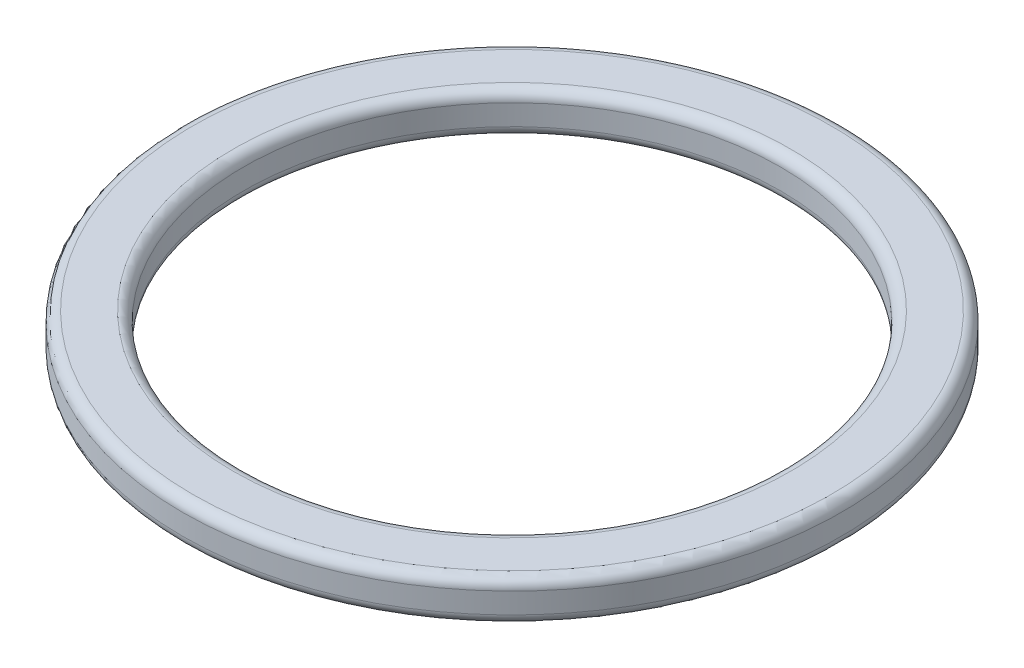
ISO-10303-21;
HEADER;
FILE_DESCRIPTION(('STEP AP214'),'2;1');
FILE_NAME('part.step','',(''),(''),'','','');
FILE_SCHEMA(('AUTOMOTIVE_DESIGN { 1 0 10303 214 1 1 1 1 }'));
ENDSEC;
DATA;
#1=APPLICATION_CONTEXT('core data for automotive mechanical design processes');
#2=APPLICATION_PROTOCOL_DEFINITION('international standard','automotive_design',2000,#1);
#3=PRODUCT_CONTEXT('',#1,'mechanical');
#4=PRODUCT('Part','Part','',(#3));
#5=PRODUCT_RELATED_PRODUCT_CATEGORY('part','',(#4));
#6=PRODUCT_DEFINITION_FORMATION('','',#4);
#7=PRODUCT_DEFINITION_CONTEXT('part definition',#1,'design');
#8=PRODUCT_DEFINITION('design','',#6,#7);
#9=PRODUCT_DEFINITION_SHAPE('','',#8);
#10=(LENGTH_UNIT() NAMED_UNIT(*) SI_UNIT(.MILLI.,.METRE.));
#11=(NAMED_UNIT(*) PLANE_ANGLE_UNIT() SI_UNIT($,.RADIAN.));
#12=(NAMED_UNIT(*) SI_UNIT($,.STERADIAN.) SOLID_ANGLE_UNIT());
#13=UNCERTAINTY_MEASURE_WITH_UNIT(LENGTH_MEASURE(1.E-05),#10,'distance_accuracy_value','');
#14=(GEOMETRIC_REPRESENTATION_CONTEXT(3) GLOBAL_UNCERTAINTY_ASSIGNED_CONTEXT((#13)) GLOBAL_UNIT_ASSIGNED_CONTEXT((#10,
#11,#12)) REPRESENTATION_CONTEXT('',''));
#15=CARTESIAN_POINT('',(0.,0.,0.));
#16=DIRECTION('',(0.,0.,1.));
#17=DIRECTION('',(1.,0.,0.));
#18=AXIS2_PLACEMENT_3D('',#15,#16,#17);
#19=CARTESIAN_POINT('',(0.,2.,0.));
#20=DIRECTION('',(0.,1.,0.));
#21=DIRECTION('',(0.,0.,1.));
#22=AXIS2_PLACEMENT_3D('',#19,#20,#21);
#23=PLANE('',#22);
#24=CARTESIAN_POINT('',(0.,2.,0.));
#25=DIRECTION('',(0.,1.,0.));
#26=DIRECTION('',(0.,0.,1.));
#27=AXIS2_PLACEMENT_3D('',#24,#25,#26);
#28=CIRCLE('',#27,13.5);
#29=CARTESIAN_POINT('',(0.,2.,13.5));
#30=VERTEX_POINT('',#29);
#31=EDGE_CURVE('E10',#30,#30,#28,.F.);
#32=ORIENTED_EDGE('',*,*,#31,.T.);
#33=EDGE_LOOP('',(#32));
#34=FACE_BOUND('',#33,.T.);
#35=CARTESIAN_POINT('',(0.,2.,0.));
#36=DIRECTION('',(0.,1.,0.));
#37=DIRECTION('',(0.,0.,1.));
#38=AXIS2_PLACEMENT_3D('',#35,#36,#37);
#39=CIRCLE('',#38,15.45);
#40=CARTESIAN_POINT('',(0.,2.,15.45));
#41=VERTEX_POINT('',#40);
#42=EDGE_CURVE('E46',#41,#41,#39,.T.);
#43=ORIENTED_EDGE('',*,*,#42,.T.);
#44=EDGE_LOOP('',(#43));
#45=FACE_BOUND('',#44,.T.);
#46=ADVANCED_FACE('F38',(#34,#45),#23,.T.);
#47=CARTESIAN_POINT('',(0.,0.,0.));
#48=DIRECTION('',(0.,1.,0.));
#49=DIRECTION('',(0.,0.,1.));
#50=AXIS2_PLACEMENT_3D('',#47,#48,#49);
#51=PLANE('',#50);
#52=CARTESIAN_POINT('',(0.,0.,0.));
#53=DIRECTION('',(0.,1.,0.));
#54=DIRECTION('',(0.,0.,1.));
#55=AXIS2_PLACEMENT_3D('',#52,#53,#54);
#56=CIRCLE('',#55,13.5);
#57=CARTESIAN_POINT('',(0.,0.,13.5));
#58=VERTEX_POINT('',#57);
#59=EDGE_CURVE('E70',#58,#58,#56,.T.);
#60=ORIENTED_EDGE('',*,*,#59,.T.);
#61=EDGE_LOOP('',(#60));
#62=FACE_BOUND('',#61,.T.);
#63=CARTESIAN_POINT('',(0.,0.,0.));
#64=DIRECTION('',(0.,1.,0.));
#65=DIRECTION('',(0.,0.,1.));
#66=AXIS2_PLACEMENT_3D('',#63,#64,#65);
#67=CIRCLE('',#66,15.45);
#68=CARTESIAN_POINT('',(0.,0.,15.45));
#69=VERTEX_POINT('',#68);
#70=EDGE_CURVE('E74',#69,#69,#67,.F.);
#71=ORIENTED_EDGE('',*,*,#70,.T.);
#72=EDGE_LOOP('',(#71));
#73=FACE_BOUND('',#72,.T.);
#74=ADVANCED_FACE('F79',(#62,#73),#51,.F.);
#75=CARTESIAN_POINT('',(0.,2.,0.));
#76=DIRECTION('',(0.,-1.,0.));
#77=DIRECTION('',(0.,0.,-1.));
#78=AXIS2_PLACEMENT_3D('',#75,#76,#77);
#79=CYLINDRICAL_SURFACE('',#78,15.95);
#80=CARTESIAN_POINT('',(0.,0.5,0.));
#81=DIRECTION('',(0.,1.,0.));
#82=DIRECTION('',(0.,0.,1.));
#83=AXIS2_PLACEMENT_3D('',#80,#81,#82);
#84=CIRCLE('',#83,15.95);
#85=CARTESIAN_POINT('',(0.,0.5,15.95));
#86=VERTEX_POINT('',#85);
#87=EDGE_CURVE('E51',#86,#86,#84,.T.);
#88=ORIENTED_EDGE('',*,*,#87,.T.);
#89=EDGE_LOOP('',(#88));
#90=FACE_BOUND('',#89,.T.);
#91=CARTESIAN_POINT('',(0.,1.5,0.));
#92=DIRECTION('',(0.,1.,0.));
#93=DIRECTION('',(0.,0.,1.));
#94=AXIS2_PLACEMENT_3D('',#91,#92,#93);
#95=CIRCLE('',#94,15.95);
#96=CARTESIAN_POINT('',(0.,1.5,15.95));
#97=VERTEX_POINT('',#96);
#98=EDGE_CURVE('E57',#97,#97,#95,.F.);
#99=ORIENTED_EDGE('',*,*,#98,.T.);
#100=EDGE_LOOP('',(#99));
#101=FACE_BOUND('',#100,.T.);
#102=ADVANCED_FACE('F89',(#90,#101),#79,.T.);
#103=CARTESIAN_POINT('',(0.,2.,0.));
#104=DIRECTION('',(0.,-1.,0.));
#105=DIRECTION('',(0.,0.,-1.));
#106=AXIS2_PLACEMENT_3D('',#103,#104,#105);
#107=CYLINDRICAL_SURFACE('',#106,13.);
#108=CARTESIAN_POINT('',(0.,0.5,0.));
#109=DIRECTION('',(0.,1.,0.));
#110=DIRECTION('',(0.,0.,1.));
#111=AXIS2_PLACEMENT_3D('',#108,#109,#110);
#112=CIRCLE('',#111,13.);
#113=CARTESIAN_POINT('',(0.,0.5,13.));
#114=VERTEX_POINT('',#113);
#115=EDGE_CURVE('E62',#114,#114,#112,.F.);
#116=ORIENTED_EDGE('',*,*,#115,.T.);
#117=EDGE_LOOP('',(#116));
#118=FACE_BOUND('',#117,.T.);
#119=CARTESIAN_POINT('',(0.,1.5,0.));
#120=DIRECTION('',(0.,1.,0.));
#121=DIRECTION('',(0.,0.,1.));
#122=AXIS2_PLACEMENT_3D('',#119,#120,#121);
#123=CIRCLE('',#122,13.);
#124=CARTESIAN_POINT('',(0.,1.5,13.));
#125=VERTEX_POINT('',#124);
#126=EDGE_CURVE('E66',#125,#125,#123,.T.);
#127=ORIENTED_EDGE('',*,*,#126,.T.);
#128=EDGE_LOOP('',(#127));
#129=FACE_BOUND('',#128,.T.);
#130=ADVANCED_FACE('F92',(#118,#129),#107,.F.);
#131=CARTESIAN_POINT('',(0.,0.5,0.));
#132=DIRECTION('',(0.,1.,0.));
#133=DIRECTION('',(0.,0.,1.));
#134=AXIS2_PLACEMENT_3D('',#131,#132,#133);
#135=TOROIDAL_SURFACE('',#134,13.5,0.5);
#136=ORIENTED_EDGE('',*,*,#115,.F.);
#137=EDGE_LOOP('',(#136));
#138=FACE_BOUND('',#137,.T.);
#139=ORIENTED_EDGE('',*,*,#59,.F.);
#140=EDGE_LOOP('',(#139));
#141=FACE_BOUND('',#140,.T.);
#142=ADVANCED_FACE('F85',(#138,#141),#135,.T.);
#143=CARTESIAN_POINT('',(0.,0.5,0.));
#144=DIRECTION('',(0.,1.,0.));
#145=DIRECTION('',(0.,0.,1.));
#146=AXIS2_PLACEMENT_3D('',#143,#144,#145);
#147=TOROIDAL_SURFACE('',#146,15.45,0.5);
#148=ORIENTED_EDGE('',*,*,#70,.F.);
#149=EDGE_LOOP('',(#148));
#150=FACE_BOUND('',#149,.T.);
#151=ORIENTED_EDGE('',*,*,#87,.F.);
#152=EDGE_LOOP('',(#151));
#153=FACE_BOUND('',#152,.T.);
#154=ADVANCED_FACE('F81',(#150,#153),#147,.T.);
#155=CARTESIAN_POINT('',(0.,1.5,0.));
#156=DIRECTION('',(0.,1.,0.));
#157=DIRECTION('',(0.,0.,1.));
#158=AXIS2_PLACEMENT_3D('',#155,#156,#157);
#159=TOROIDAL_SURFACE('',#158,13.5,0.5);
#160=ORIENTED_EDGE('',*,*,#31,.F.);
#161=EDGE_LOOP('',(#160));
#162=FACE_BOUND('',#161,.T.);
#163=ORIENTED_EDGE('',*,*,#126,.F.);
#164=EDGE_LOOP('',(#163));
#165=FACE_BOUND('',#164,.T.);
#166=ADVANCED_FACE('F84',(#162,#165),#159,.T.);
#167=CARTESIAN_POINT('',(0.,1.5,0.));
#168=DIRECTION('',(0.,1.,0.));
#169=DIRECTION('',(0.,0.,1.));
#170=AXIS2_PLACEMENT_3D('',#167,#168,#169);
#171=TOROIDAL_SURFACE('',#170,15.45,0.5);
#172=ORIENTED_EDGE('',*,*,#98,.F.);
#173=EDGE_LOOP('',(#172));
#174=FACE_BOUND('',#173,.T.);
#175=ORIENTED_EDGE('',*,*,#42,.F.);
#176=EDGE_LOOP('',(#175));
#177=FACE_BOUND('',#176,.T.);
#178=ADVANCED_FACE('F40',(#174,#177),#171,.T.);
#179=CLOSED_SHELL('',(#46,#74,#102,#130,#142,#154,#166,#178));
#180=MANIFOLD_SOLID_BREP('B2',#179);
#181=ADVANCED_BREP_SHAPE_REPRESENTATION('',(#18,#180),#14);
#182=SHAPE_DEFINITION_REPRESENTATION(#9,#181);
ENDSEC;
END-ISO-10303-21;
